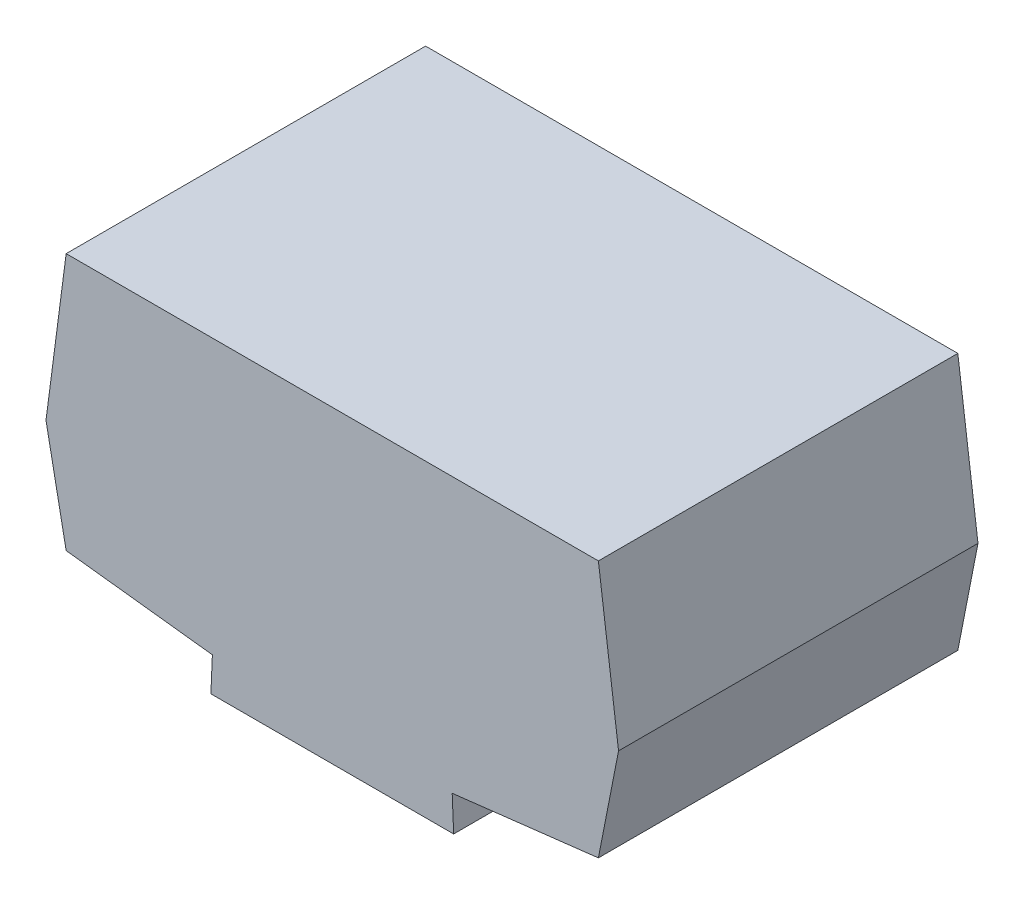
ISO-10303-21;
HEADER;
FILE_DESCRIPTION(('STEP AP214'),'2;1');
FILE_NAME('part.step','',(''),(''),'','','');
FILE_SCHEMA(('AUTOMOTIVE_DESIGN { 1 0 10303 214 1 1 1 1 }'));
ENDSEC;
DATA;
#1=APPLICATION_CONTEXT('core data for automotive mechanical design processes');
#2=APPLICATION_PROTOCOL_DEFINITION('international standard','automotive_design',2000,#1);
#3=PRODUCT_CONTEXT('',#1,'mechanical');
#4=PRODUCT('Part','Part','',(#3));
#5=PRODUCT_RELATED_PRODUCT_CATEGORY('part','',(#4));
#6=PRODUCT_DEFINITION_FORMATION('','',#4);
#7=PRODUCT_DEFINITION_CONTEXT('part definition',#1,'design');
#8=PRODUCT_DEFINITION('design','',#6,#7);
#9=PRODUCT_DEFINITION_SHAPE('','',#8);
#10=(LENGTH_UNIT() NAMED_UNIT(*) SI_UNIT(.MILLI.,.METRE.));
#11=(NAMED_UNIT(*) PLANE_ANGLE_UNIT() SI_UNIT($,.RADIAN.));
#12=(NAMED_UNIT(*) SI_UNIT($,.STERADIAN.) SOLID_ANGLE_UNIT());
#13=UNCERTAINTY_MEASURE_WITH_UNIT(LENGTH_MEASURE(1.E-05),#10,'distance_accuracy_value','');
#14=(GEOMETRIC_REPRESENTATION_CONTEXT(3) GLOBAL_UNCERTAINTY_ASSIGNED_CONTEXT((#13)) GLOBAL_UNIT_ASSIGNED_CONTEXT((#10,
#11,#12)) REPRESENTATION_CONTEXT('',''));
#15=CARTESIAN_POINT('',(0.,0.,0.));
#16=DIRECTION('',(0.,0.,1.));
#17=DIRECTION('',(1.,0.,0.));
#18=AXIS2_PLACEMENT_3D('',#15,#16,#17);
#19=CARTESIAN_POINT('',(0.889,-0.889,0.));
#20=DIRECTION('',(-0.116362693419985,0.993206787924874,0.));
#21=DIRECTION('',(-0.993206787924874,-0.116362693419985,0.));
#22=AXIS2_PLACEMENT_3D('',#19,#20,#21);
#23=PLANE('',#22);
#24=DIRECTION('',(0.,0.,1.));
#25=VECTOR('',#24,1.);
#26=CARTESIAN_POINT('',(1.97300088,-0.762,0.));
#27=LINE('',#26,#25);
#28=CARTESIAN_POINT('',(1.97300088,-0.762000000000012,0.));
#29=VERTEX_POINT('',#28);
#30=CARTESIAN_POINT('',(1.97300088,-0.762000000000012,2.66500102));
#31=VERTEX_POINT('',#30);
#32=EDGE_CURVE('E133',#29,#31,#27,.T.);
#33=ORIENTED_EDGE('',*,*,#32,.T.);
#34=DIRECTION('',(-0.993206787924874,-0.116362693419985,0.));
#35=VECTOR('',#34,1.);
#36=CARTESIAN_POINT('',(0.889,-0.889,2.66500102));
#37=LINE('',#36,#35);
#38=CARTESIAN_POINT('',(0.888999999999977,-0.889000000000001,2.66500102));
#39=VERTEX_POINT('',#38);
#40=EDGE_CURVE('E20',#39,#31,#37,.F.);
#41=ORIENTED_EDGE('',*,*,#40,.F.);
#42=DIRECTION('',(0.,0.,1.));
#43=VECTOR('',#42,1.);
#44=CARTESIAN_POINT('',(0.888999999999909,-0.889000000000004,0.));
#45=LINE('',#44,#43);
#46=CARTESIAN_POINT('',(0.888999999999977,-0.889000000000001,0.));
#47=VERTEX_POINT('',#46);
#48=EDGE_CURVE('E141',#39,#47,#45,.F.);
#49=ORIENTED_EDGE('',*,*,#48,.T.);
#50=DIRECTION('',(-0.993206787924874,-0.116362693419985,0.));
#51=VECTOR('',#50,1.);
#52=CARTESIAN_POINT('',(0.889,-0.889,0.));
#53=LINE('',#52,#51);
#54=EDGE_CURVE('E104',#29,#47,#53,.T.);
#55=ORIENTED_EDGE('',*,*,#54,.F.);
#56=EDGE_LOOP('',(#33,#41,#49,#55));
#57=FACE_BOUND('',#56,.T.);
#58=ADVANCED_FACE('F17',(#57),#23,.F.);
#59=CARTESIAN_POINT('',(-1.97300088,-0.762,0.));
#60=DIRECTION('',(0.116362693419985,0.993206787924874,0.));
#61=DIRECTION('',(-0.993206787924874,0.116362693419985,0.));
#62=AXIS2_PLACEMENT_3D('',#59,#60,#61);
#63=PLANE('',#62);
#64=DIRECTION('',(0.,0.,1.));
#65=VECTOR('',#64,1.);
#66=CARTESIAN_POINT('',(-0.889,-0.889,0.));
#67=LINE('',#66,#65);
#68=CARTESIAN_POINT('',(-0.888999999999999,-0.888999999999988,0.));
#69=VERTEX_POINT('',#68);
#70=CARTESIAN_POINT('',(-0.888999999999999,-0.888999999999988,2.66500102));
#71=VERTEX_POINT('',#70);
#72=EDGE_CURVE('E108',#69,#71,#67,.T.);
#73=ORIENTED_EDGE('',*,*,#72,.T.);
#74=DIRECTION('',(-0.993206787924874,0.116362693419985,0.));
#75=VECTOR('',#74,1.);
#76=CARTESIAN_POINT('',(-1.97300088,-0.762,2.66500102));
#77=LINE('',#76,#75);
#78=CARTESIAN_POINT('',(-1.97300087999992,-0.761999999999985,2.66500102));
#79=VERTEX_POINT('',#78);
#80=EDGE_CURVE('E95',#79,#71,#77,.F.);
#81=ORIENTED_EDGE('',*,*,#80,.F.);
#82=DIRECTION('',(0.,0.,1.));
#83=VECTOR('',#82,1.);
#84=CARTESIAN_POINT('',(-1.97300087999969,-0.761999999999939,0.));
#85=LINE('',#84,#83);
#86=CARTESIAN_POINT('',(-1.97300087999992,-0.761999999999985,0.));
#87=VERTEX_POINT('',#86);
#88=EDGE_CURVE('E160',#79,#87,#85,.F.);
#89=ORIENTED_EDGE('',*,*,#88,.T.);
#90=DIRECTION('',(-0.993206787924874,0.116362693419985,0.));
#91=VECTOR('',#90,1.);
#92=CARTESIAN_POINT('',(-1.97300088,-0.762,0.));
#93=LINE('',#92,#91);
#94=EDGE_CURVE('E90',#69,#87,#93,.T.);
#95=ORIENTED_EDGE('',*,*,#94,.F.);
#96=EDGE_LOOP('',(#73,#81,#89,#95));
#97=FACE_BOUND('',#96,.T.);
#98=ADVANCED_FACE('F115',(#97),#63,.F.);
#99=CARTESIAN_POINT('',(-0.889,-0.889,0.));
#100=DIRECTION('',(0.999077988420994,-0.0429321913330797,0.));
#101=DIRECTION('',(0.0429321913330797,0.999077988420994,0.));
#102=AXIS2_PLACEMENT_3D('',#99,#100,#101);
#103=PLANE('',#102);
#104=DIRECTION('',(0.,0.,1.));
#105=VECTOR('',#104,1.);
#106=CARTESIAN_POINT('',(-0.90000074,-1.14499898,0.));
#107=LINE('',#106,#105);
#108=CARTESIAN_POINT('',(-0.900000740000045,-1.14499898,0.));
#109=VERTEX_POINT('',#108);
#110=CARTESIAN_POINT('',(-0.900000740000045,-1.14499898,2.66500102));
#111=VERTEX_POINT('',#110);
#112=EDGE_CURVE('E111',#109,#111,#107,.T.);
#113=ORIENTED_EDGE('',*,*,#112,.T.);
#114=DIRECTION('',(0.0429321913330797,0.999077988420994,0.));
#115=VECTOR('',#114,1.);
#116=CARTESIAN_POINT('',(-0.889,-0.889,2.66500102));
#117=LINE('',#116,#115);
#118=EDGE_CURVE('E99',#71,#111,#117,.F.);
#119=ORIENTED_EDGE('',*,*,#118,.F.);
#120=ORIENTED_EDGE('',*,*,#72,.F.);
#121=DIRECTION('',(0.0429321913330797,0.999077988420994,0.));
#122=VECTOR('',#121,1.);
#123=CARTESIAN_POINT('',(-0.889,-0.889,0.));
#124=LINE('',#123,#122);
#125=EDGE_CURVE('E113',#109,#69,#124,.T.);
#126=ORIENTED_EDGE('',*,*,#125,.F.);
#127=EDGE_LOOP('',(#113,#119,#120,#126));
#128=FACE_BOUND('',#127,.T.);
#129=ADVANCED_FACE('F107',(#128),#103,.F.);
#130=CARTESIAN_POINT('',(0.90000074,-1.14499898,0.));
#131=DIRECTION('',(-0.999077988420994,-0.0429321913330797,0.));
#132=DIRECTION('',(0.0429321913330797,-0.999077988420994,0.));
#133=AXIS2_PLACEMENT_3D('',#130,#131,#132);
#134=PLANE('',#133);
#135=ORIENTED_EDGE('',*,*,#48,.F.);
#136=DIRECTION('',(0.0429321913330797,-0.999077988420994,0.));
#137=VECTOR('',#136,1.);
#138=CARTESIAN_POINT('',(0.90000074,-1.14499898,2.66500102));
#139=LINE('',#138,#137);
#140=CARTESIAN_POINT('',(0.90000074,-1.14499898,2.66500102));
#141=VERTEX_POINT('',#140);
#142=EDGE_CURVE('E125',#141,#39,#139,.F.);
#143=ORIENTED_EDGE('',*,*,#142,.F.);
#144=DIRECTION('',(0.,0.,1.));
#145=VECTOR('',#144,1.);
#146=CARTESIAN_POINT('',(0.90000074,-1.14499898,0.));
#147=LINE('',#146,#145);
#148=CARTESIAN_POINT('',(0.90000074,-1.14499898,0.));
#149=VERTEX_POINT('',#148);
#150=EDGE_CURVE('E155',#141,#149,#147,.F.);
#151=ORIENTED_EDGE('',*,*,#150,.T.);
#152=DIRECTION('',(0.0429321913330797,-0.999077988420994,0.));
#153=VECTOR('',#152,1.);
#154=CARTESIAN_POINT('',(0.90000074,-1.14499898,0.));
#155=LINE('',#154,#153);
#156=EDGE_CURVE('E139',#47,#149,#155,.T.);
#157=ORIENTED_EDGE('',*,*,#156,.F.);
#158=EDGE_LOOP('',(#135,#143,#151,#157));
#159=FACE_BOUND('',#158,.T.);
#160=ADVANCED_FACE('F218',(#159),#134,.F.);
#161=CARTESIAN_POINT('',(1.97300088,-0.762,0.));
#162=DIRECTION('',(-0.981292453874691,0.192523037500939,0.));
#163=DIRECTION('',(-0.192523037500939,-0.981292453874691,0.));
#164=AXIS2_PLACEMENT_3D('',#161,#162,#163);
#165=PLANE('',#164);
#166=DIRECTION('',(0.,0.,1.));
#167=VECTOR('',#166,1.);
#168=CARTESIAN_POINT('',(2.1225002,0.,0.));
#169=LINE('',#168,#167);
#170=CARTESIAN_POINT('',(2.12250020000016,0.,0.));
#171=VERTEX_POINT('',#170);
#172=CARTESIAN_POINT('',(2.12250020000016,0.,2.66500102));
#173=VERTEX_POINT('',#172);
#174=EDGE_CURVE('E135',#171,#173,#169,.T.);
#175=ORIENTED_EDGE('',*,*,#174,.T.);
#176=DIRECTION('',(-0.192523037500939,-0.981292453874691,0.));
#177=VECTOR('',#176,1.);
#178=CARTESIAN_POINT('',(1.97300088,-0.762,2.66500102));
#179=LINE('',#178,#177);
#180=EDGE_CURVE('E123',#31,#173,#179,.F.);
#181=ORIENTED_EDGE('',*,*,#180,.F.);
#182=ORIENTED_EDGE('',*,*,#32,.F.);
#183=DIRECTION('',(-0.192523037500939,-0.981292453874691,0.));
#184=VECTOR('',#183,1.);
#185=CARTESIAN_POINT('',(1.97300088,-0.762,0.));
#186=LINE('',#185,#184);
#187=EDGE_CURVE('E137',#171,#29,#186,.T.);
#188=ORIENTED_EDGE('',*,*,#187,.F.);
#189=EDGE_LOOP('',(#175,#181,#182,#188));
#190=FACE_BOUND('',#189,.T.);
#191=ADVANCED_FACE('F132',(#190),#165,.F.);
#192=CARTESIAN_POINT('',(-2.1225002,0.,0.));
#193=DIRECTION('',(0.981292453874691,0.192523037500939,0.));
#194=DIRECTION('',(-0.192523037500939,0.981292453874691,0.));
#195=AXIS2_PLACEMENT_3D('',#192,#193,#194);
#196=PLANE('',#195);
#197=ORIENTED_EDGE('',*,*,#88,.F.);
#198=DIRECTION('',(-0.192523037500537,0.98129245387477,0.));
#199=VECTOR('',#198,1.);
#200=CARTESIAN_POINT('',(-1.97300088,-0.762,2.66500102));
#201=LINE('',#200,#199);
#202=CARTESIAN_POINT('',(-2.12250020000011,0.,2.66500102));
#203=VERTEX_POINT('',#202);
#204=EDGE_CURVE('E102',#79,#203,#201,.T.);
#205=ORIENTED_EDGE('',*,*,#204,.T.);
#206=DIRECTION('',(0.,0.,1.));
#207=VECTOR('',#206,1.);
#208=CARTESIAN_POINT('',(-2.12250020000046,0.,0.));
#209=LINE('',#208,#207);
#210=CARTESIAN_POINT('',(-2.12250020000011,0.,0.));
#211=VERTEX_POINT('',#210);
#212=EDGE_CURVE('E177',#203,#211,#209,.F.);
#213=ORIENTED_EDGE('',*,*,#212,.T.);
#214=DIRECTION('',(-0.192523037500939,0.981292453874691,0.));
#215=VECTOR('',#214,1.);
#216=CARTESIAN_POINT('',(-2.1225002,0.,0.));
#217=LINE('',#216,#215);
#218=EDGE_CURVE('E156',#87,#211,#217,.T.);
#219=ORIENTED_EDGE('',*,*,#218,.F.);
#220=EDGE_LOOP('',(#197,#205,#213,#219));
#221=FACE_BOUND('',#220,.T.);
#222=ADVANCED_FACE('F212',(#221),#196,.F.);
#223=CARTESIAN_POINT('',(-0.90000074,-1.14499898,0.));
#224=DIRECTION('',(0.,1.,0.));
#225=DIRECTION('',(0.,0.,1.));
#226=AXIS2_PLACEMENT_3D('',#223,#224,#225);
#227=PLANE('',#226);
#228=ORIENTED_EDGE('',*,*,#150,.F.);
#229=DIRECTION('',(-1.,0.,0.));
#230=VECTOR('',#229,1.);
#231=CARTESIAN_POINT('',(-1.97300088,-1.14499898,2.66500102));
#232=LINE('',#231,#230);
#233=EDGE_CURVE('E154',#141,#111,#232,.T.);
#234=ORIENTED_EDGE('',*,*,#233,.T.);
#235=ORIENTED_EDGE('',*,*,#112,.F.);
#236=DIRECTION('',(-1.,0.,0.));
#237=VECTOR('',#236,1.);
#238=CARTESIAN_POINT('',(-1.97300088,-1.14499898,0.));
#239=LINE('',#238,#237);
#240=EDGE_CURVE('E150',#149,#109,#239,.T.);
#241=ORIENTED_EDGE('',*,*,#240,.F.);
#242=EDGE_LOOP('',(#228,#234,#235,#241));
#243=FACE_BOUND('',#242,.T.);
#244=ADVANCED_FACE('F153',(#243),#227,.F.);
#245=CARTESIAN_POINT('',(2.1225002,0.,0.));
#246=DIRECTION('',(-0.991583561796775,-0.129468297178971,0.));
#247=DIRECTION('',(0.129468297178971,-0.991583561796775,0.));
#248=AXIS2_PLACEMENT_3D('',#245,#246,#247);
#249=PLANE('',#248);
#250=DIRECTION('',(0.,0.,-1.));
#251=VECTOR('',#250,1.);
#252=CARTESIAN_POINT('',(1.97300088,1.14499898,0.));
#253=LINE('',#252,#251);
#254=CARTESIAN_POINT('',(1.97300087999977,1.14499897999997,0.));
#255=VERTEX_POINT('',#254);
#256=CARTESIAN_POINT('',(1.97300087999977,1.14499897999997,2.66500102));
#257=VERTEX_POINT('',#256);
#258=EDGE_CURVE('E183',#255,#257,#253,.F.);
#259=ORIENTED_EDGE('',*,*,#258,.T.);
#260=DIRECTION('',(0.129468297178574,-0.991583561796826,0.));
#261=VECTOR('',#260,1.);
#262=CARTESIAN_POINT('',(1.97300088,1.14499898,2.66500102));
#263=LINE('',#262,#261);
#264=EDGE_CURVE('E170',#257,#173,#263,.T.);
#265=ORIENTED_EDGE('',*,*,#264,.T.);
#266=ORIENTED_EDGE('',*,*,#174,.F.);
#267=DIRECTION('',(0.129468297178574,-0.991583561796826,0.));
#268=VECTOR('',#267,1.);
#269=CARTESIAN_POINT('',(1.97300088,1.14499898,0.));
#270=LINE('',#269,#268);
#271=EDGE_CURVE('E166',#255,#171,#270,.T.);
#272=ORIENTED_EDGE('',*,*,#271,.F.);
#273=EDGE_LOOP('',(#259,#265,#266,#272));
#274=FACE_BOUND('',#273,.T.);
#275=ADVANCED_FACE('F169',(#274),#249,.F.);
#276=CARTESIAN_POINT('',(-1.97300088,1.14499898,2.66500102));
#277=DIRECTION('',(0.,0.,-1.));
#278=DIRECTION('',(-1.,0.,0.));
#279=AXIS2_PLACEMENT_3D('',#276,#277,#278);
#280=PLANE('',#279);
#281=ORIENTED_EDGE('',*,*,#204,.F.);
#282=ORIENTED_EDGE('',*,*,#80,.T.);
#283=ORIENTED_EDGE('',*,*,#118,.T.);
#284=ORIENTED_EDGE('',*,*,#233,.F.);
#285=ORIENTED_EDGE('',*,*,#142,.T.);
#286=ORIENTED_EDGE('',*,*,#40,.T.);
#287=ORIENTED_EDGE('',*,*,#180,.T.);
#288=ORIENTED_EDGE('',*,*,#264,.F.);
#289=DIRECTION('',(1.,0.,0.));
#290=VECTOR('',#289,1.);
#291=CARTESIAN_POINT('',(1.97300088,1.14499898,2.66500102));
#292=LINE('',#291,#290);
#293=CARTESIAN_POINT('',(-1.97300088,1.14499898,2.66500102));
#294=VERTEX_POINT('',#293);
#295=EDGE_CURVE('E185',#257,#294,#292,.F.);
#296=ORIENTED_EDGE('',*,*,#295,.T.);
#297=DIRECTION('',(0.129468297178971,0.991583561796775,0.));
#298=VECTOR('',#297,1.);
#299=CARTESIAN_POINT('',(-1.97300088,1.14499898,2.66500102));
#300=LINE('',#299,#298);
#301=EDGE_CURVE('E175',#294,#203,#300,.F.);
#302=ORIENTED_EDGE('',*,*,#301,.T.);
#303=EDGE_LOOP('',(#281,#282,#283,#284,#285,#286,#287,#288,#296,#302));
#304=FACE_BOUND('',#303,.T.);
#305=ADVANCED_FACE('F97',(#304),#280,.F.);
#306=CARTESIAN_POINT('',(-1.97300088,1.14499898,0.));
#307=DIRECTION('',(0.991583561796775,-0.129468297178971,0.));
#308=DIRECTION('',(0.129468297178971,0.991583561796775,0.));
#309=AXIS2_PLACEMENT_3D('',#306,#307,#308);
#310=PLANE('',#309);
#311=ORIENTED_EDGE('',*,*,#212,.F.);
#312=ORIENTED_EDGE('',*,*,#301,.F.);
#313=DIRECTION('',(0.,0.,-1.));
#314=VECTOR('',#313,1.);
#315=CARTESIAN_POINT('',(-1.97300088,1.14499898,0.));
#316=LINE('',#315,#314);
#317=CARTESIAN_POINT('',(-1.97300088,1.14499898,0.));
#318=VERTEX_POINT('',#317);
#319=EDGE_CURVE('E26',#294,#318,#316,.T.);
#320=ORIENTED_EDGE('',*,*,#319,.T.);
#321=DIRECTION('',(0.129468297178574,0.991583561796826,0.));
#322=VECTOR('',#321,1.);
#323=CARTESIAN_POINT('',(-2.1225002,0.,0.));
#324=LINE('',#323,#322);
#325=EDGE_CURVE('E34',#211,#318,#324,.T.);
#326=ORIENTED_EDGE('',*,*,#325,.F.);
#327=EDGE_LOOP('',(#311,#312,#320,#326));
#328=FACE_BOUND('',#327,.T.);
#329=ADVANCED_FACE('F192',(#328),#310,.F.);
#330=CARTESIAN_POINT('',(-1.97300088,1.14499898,0.));
#331=DIRECTION('',(0.,0.,-1.));
#332=DIRECTION('',(-1.,0.,0.));
#333=AXIS2_PLACEMENT_3D('',#330,#331,#332);
#334=PLANE('',#333);
#335=ORIENTED_EDGE('',*,*,#218,.T.);
#336=ORIENTED_EDGE('',*,*,#325,.T.);
#337=DIRECTION('',(1.,0.,0.));
#338=VECTOR('',#337,1.);
#339=CARTESIAN_POINT('',(1.97300088,1.14499898,0.));
#340=LINE('',#339,#338);
#341=EDGE_CURVE('E11',#318,#255,#340,.T.);
#342=ORIENTED_EDGE('',*,*,#341,.T.);
#343=ORIENTED_EDGE('',*,*,#271,.T.);
#344=ORIENTED_EDGE('',*,*,#187,.T.);
#345=ORIENTED_EDGE('',*,*,#54,.T.);
#346=ORIENTED_EDGE('',*,*,#156,.T.);
#347=ORIENTED_EDGE('',*,*,#240,.T.);
#348=ORIENTED_EDGE('',*,*,#125,.T.);
#349=ORIENTED_EDGE('',*,*,#94,.T.);
#350=EDGE_LOOP('',(#335,#336,#342,#343,#344,#345,#346,#347,#348,#349));
#351=FACE_BOUND('',#350,.T.);
#352=ADVANCED_FACE('F147',(#351),#334,.T.);
#353=CARTESIAN_POINT('',(1.97300088,1.14499898,0.));
#354=DIRECTION('',(0.,-1.,0.));
#355=DIRECTION('',(0.,0.,-1.));
#356=AXIS2_PLACEMENT_3D('',#353,#354,#355);
#357=PLANE('',#356);
#358=ORIENTED_EDGE('',*,*,#319,.F.);
#359=ORIENTED_EDGE('',*,*,#295,.F.);
#360=ORIENTED_EDGE('',*,*,#258,.F.);
#361=ORIENTED_EDGE('',*,*,#341,.F.);
#362=EDGE_LOOP('',(#358,#359,#360,#361));
#363=FACE_BOUND('',#362,.T.);
#364=ADVANCED_FACE('F195',(#363),#357,.F.);
#365=CLOSED_SHELL('',(#58,#98,#129,#160,#191,#222,#244,#275,#305,#329,#352,#364));
#366=MANIFOLD_SOLID_BREP('B1',#365);
#367=ADVANCED_BREP_SHAPE_REPRESENTATION('',(#18,#366),#14);
#368=SHAPE_DEFINITION_REPRESENTATION(#9,#367);
ENDSEC;
END-ISO-10303-21;
